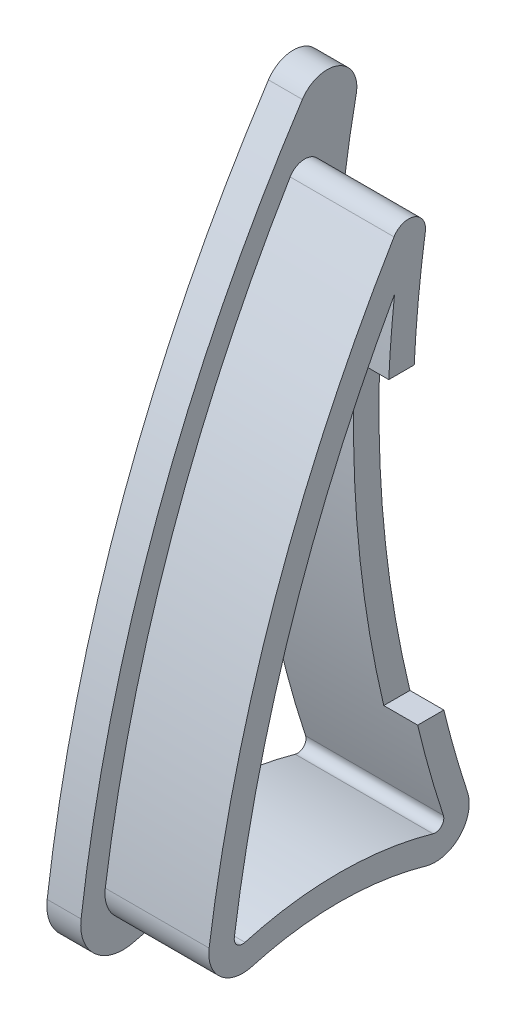
ISO-10303-21;
HEADER;
FILE_DESCRIPTION(('STEP AP214'),'2;1');
FILE_NAME('part.step','',(''),(''),'','','');
FILE_SCHEMA(('AUTOMOTIVE_DESIGN { 1 0 10303 214 1 1 1 1 }'));
ENDSEC;
DATA;
#1=APPLICATION_CONTEXT('core data for automotive mechanical design processes');
#2=APPLICATION_PROTOCOL_DEFINITION('international standard','automotive_design',2000,#1);
#3=PRODUCT_CONTEXT('',#1,'mechanical');
#4=PRODUCT('Part','Part','',(#3));
#5=PRODUCT_RELATED_PRODUCT_CATEGORY('part','',(#4));
#6=PRODUCT_DEFINITION_FORMATION('','',#4);
#7=PRODUCT_DEFINITION_CONTEXT('part definition',#1,'design');
#8=PRODUCT_DEFINITION('design','',#6,#7);
#9=PRODUCT_DEFINITION_SHAPE('','',#8);
#10=(LENGTH_UNIT() NAMED_UNIT(*) SI_UNIT(.MILLI.,.METRE.));
#11=(NAMED_UNIT(*) PLANE_ANGLE_UNIT() SI_UNIT($,.RADIAN.));
#12=(NAMED_UNIT(*) SI_UNIT($,.STERADIAN.) SOLID_ANGLE_UNIT());
#13=UNCERTAINTY_MEASURE_WITH_UNIT(LENGTH_MEASURE(1.E-05),#10,'distance_accuracy_value','');
#14=(GEOMETRIC_REPRESENTATION_CONTEXT(3) GLOBAL_UNCERTAINTY_ASSIGNED_CONTEXT((#13)) GLOBAL_UNIT_ASSIGNED_CONTEXT((#10,
#11,#12)) REPRESENTATION_CONTEXT('',''));
#15=CARTESIAN_POINT('',(0.,0.,0.));
#16=DIRECTION('',(0.,0.,1.));
#17=DIRECTION('',(1.,0.,0.));
#18=AXIS2_PLACEMENT_3D('',#15,#16,#17);
#19=CARTESIAN_POINT('',(0.,-85.725,-146.831685531547));
#20=DIRECTION('',(-1.,0.,0.));
#21=DIRECTION('',(0.,0.,-1.));
#22=AXIS2_PLACEMENT_3D('',#19,#20,#21);
#23=CYLINDRICAL_SURFACE('',#22,210.331685531547);
#24=CARTESIAN_POINT('',(-15.5575,-85.725,-146.831685531547));
#25=DIRECTION('',(1.,0.,0.));
#26=DIRECTION('',(0.,0.,-1.));
#27=AXIS2_PLACEMENT_3D('',#24,#25,#26);
#28=CIRCLE('',#27,210.331685531547);
#29=CARTESIAN_POINT('',(-15.5575,22.1489173700403,33.730314595233));
#30=VERTEX_POINT('',#29);
#31=CARTESIAN_POINT('',(-15.5575,-56.286781255573,61.4297108329661));
#32=VERTEX_POINT('',#31);
#33=EDGE_CURVE('E246',#30,#32,#28,.T.);
#34=ORIENTED_EDGE('',*,*,#33,.T.);
#35=DIRECTION('',(-1.,0.,0.));
#36=VECTOR('',#35,1.);
#37=CARTESIAN_POINT('',(0.,-56.286781255573,61.4297108329661));
#38=LINE('',#37,#36);
#39=CARTESIAN_POINT('',(0.,-56.286781255573,61.4297108329661));
#40=VERTEX_POINT('',#39);
#41=EDGE_CURVE('E245',#40,#32,#38,.T.);
#42=ORIENTED_EDGE('',*,*,#41,.F.);
#43=CARTESIAN_POINT('',(0.,-85.725,-146.831685531547));
#44=DIRECTION('',(1.,0.,0.));
#45=DIRECTION('',(0.,0.,-1.));
#46=AXIS2_PLACEMENT_3D('',#43,#44,#45);
#47=CIRCLE('',#46,210.331685531547);
#48=CARTESIAN_POINT('',(0.,22.1489173700403,33.730314595233));
#49=VERTEX_POINT('',#48);
#50=EDGE_CURVE('E223',#49,#40,#47,.T.);
#51=ORIENTED_EDGE('',*,*,#50,.F.);
#52=DIRECTION('',(-1.,0.,0.));
#53=VECTOR('',#52,1.);
#54=CARTESIAN_POINT('',(0.,22.1489173700403,33.730314595233));
#55=LINE('',#54,#53);
#56=EDGE_CURVE('E264',#49,#30,#55,.T.);
#57=ORIENTED_EDGE('',*,*,#56,.T.);
#58=EDGE_LOOP('',(#34,#42,#51,#57));
#59=FACE_BOUND('',#58,.T.);
#60=ADVANCED_FACE('F44',(#59),#23,.T.);
#61=CARTESIAN_POINT('',(0.,20.8462142160792,31.5498182084761));
#62=DIRECTION('',(-1.,0.,0.));
#63=DIRECTION('',(0.,0.,-1.));
#64=AXIS2_PLACEMENT_3D('',#61,#62,#63);
#65=CYLINDRICAL_SURFACE('',#64,2.53999999999998);
#66=CARTESIAN_POINT('',(-15.5575,20.8462142160792,31.5498182084761));
#67=DIRECTION('',(1.,0.,0.));
#68=DIRECTION('',(0.,0.,-1.));
#69=AXIS2_PLACEMENT_3D('',#66,#67,#68);
#70=CIRCLE('',#69,2.53999999999998);
#71=CARTESIAN_POINT('',(-15.5575,20.4641245910413,29.0387213329179));
#72=VERTEX_POINT('',#71);
#73=EDGE_CURVE('E228',#72,#30,#70,.T.);
#74=ORIENTED_EDGE('',*,*,#73,.T.);
#75=ORIENTED_EDGE('',*,*,#56,.F.);
#76=CARTESIAN_POINT('',(0.,20.8462142160792,31.5498182084761));
#77=DIRECTION('',(1.,0.,0.));
#78=DIRECTION('',(0.,0.,-1.));
#79=AXIS2_PLACEMENT_3D('',#76,#77,#78);
#80=CIRCLE('',#79,2.53999999999998);
#81=CARTESIAN_POINT('',(0.,20.4641245910413,29.0387213329179));
#82=VERTEX_POINT('',#81);
#83=EDGE_CURVE('E242',#82,#49,#80,.T.);
#84=ORIENTED_EDGE('',*,*,#83,.F.);
#85=DIRECTION('',(-1.,0.,0.));
#86=VECTOR('',#85,1.);
#87=CARTESIAN_POINT('',(0.,20.4641245910413,29.0387213329179));
#88=LINE('',#87,#86);
#89=EDGE_CURVE('E268',#82,#72,#88,.T.);
#90=ORIENTED_EDGE('',*,*,#89,.T.);
#91=EDGE_LOOP('',(#74,#75,#84,#90));
#92=FACE_BOUND('',#91,.T.);
#93=ADVANCED_FACE('F458',(#92),#65,.T.);
#94=CARTESIAN_POINT('',(0.,-4.22030411994143,-133.187593513881));
#95=DIRECTION('',(-1.,0.,0.));
#96=DIRECTION('',(0.,0.,-1.));
#97=AXIS2_PLACEMENT_3D('',#94,#95,#96);
#98=CYLINDRICAL_SURFACE('',#97,164.093565533692);
#99=DIRECTION('',(-1.,0.,0.));
#100=VECTOR('',#99,1.);
#101=CARTESIAN_POINT('',(0.,-42.9737697069895,26.2641771083162));
#102=LINE('',#101,#100);
#103=CARTESIAN_POINT('',(-5.08,-42.9737697069895,26.2641771083162));
#104=VERTEX_POINT('',#103);
#105=CARTESIAN_POINT('',(0.,-42.9737697069895,26.2641771083162));
#106=VERTEX_POINT('',#105);
#107=EDGE_CURVE('E326',#104,#106,#102,.F.);
#108=ORIENTED_EDGE('',*,*,#107,.T.);
#109=CARTESIAN_POINT('',(0.,-4.22030411994143,-133.187593513881));
#110=DIRECTION('',(-1.,0.,0.));
#111=DIRECTION('',(0.,0.,-1.));
#112=AXIS2_PLACEMENT_3D('',#109,#110,#111);
#113=CIRCLE('',#112,164.093565533692);
#114=CARTESIAN_POINT('',(0.,-55.4129631360347,22.7162547786557));
#115=VERTEX_POINT('',#114);
#116=EDGE_CURVE('E238',#115,#106,#113,.T.);
#117=ORIENTED_EDGE('',*,*,#116,.F.);
#118=DIRECTION('',(-1.,0.,0.));
#119=VECTOR('',#118,1.);
#120=CARTESIAN_POINT('',(0.,-55.4129631360347,22.7162547786557));
#121=LINE('',#120,#119);
#122=CARTESIAN_POINT('',(-15.5575,-55.4129631360347,22.7162547786557));
#123=VERTEX_POINT('',#122);
#124=EDGE_CURVE('E272',#115,#123,#121,.T.);
#125=ORIENTED_EDGE('',*,*,#124,.T.);
#126=CARTESIAN_POINT('',(-15.5575,-4.22030411994143,-133.187593513881));
#127=DIRECTION('',(-1.,0.,0.));
#128=DIRECTION('',(0.,0.,-1.));
#129=AXIS2_PLACEMENT_3D('',#126,#127,#128);
#130=CIRCLE('',#129,164.093565533692);
#131=EDGE_CURVE('E259',#123,#72,#130,.T.);
#132=ORIENTED_EDGE('',*,*,#131,.T.);
#133=ORIENTED_EDGE('',*,*,#89,.F.);
#134=CARTESIAN_POINT('',(0.,4.01623029301051,30.6991287988939));
#135=VERTEX_POINT('',#134);
#136=EDGE_CURVE('E237',#135,#82,#113,.T.);
#137=ORIENTED_EDGE('',*,*,#136,.F.);
#138=DIRECTION('',(-1.,0.,0.));
#139=VECTOR('',#138,1.);
#140=CARTESIAN_POINT('',(0.,4.01623029301051,30.6991287988938));
#141=LINE('',#140,#139);
#142=CARTESIAN_POINT('',(-5.08,4.01623029301051,30.6991287988939));
#143=VERTEX_POINT('',#142);
#144=EDGE_CURVE('E319',#135,#143,#141,.T.);
#145=ORIENTED_EDGE('',*,*,#144,.T.);
#146=CARTESIAN_POINT('',(-5.08,-4.22030411994143,-133.187593513881));
#147=DIRECTION('',(1.,0.,0.));
#148=DIRECTION('',(0.,0.,-1.));
#149=AXIS2_PLACEMENT_3D('',#146,#147,#148);
#150=CIRCLE('',#149,164.093565533692);
#151=EDGE_CURVE('E308',#143,#104,#150,.T.);
#152=ORIENTED_EDGE('',*,*,#151,.T.);
#153=EDGE_LOOP('',(#108,#117,#125,#132,#133,#137,#145,#152));
#154=FACE_BOUND('',#153,.T.);
#155=ADVANCED_FACE('F463',(#154),#98,.F.);
#156=CARTESIAN_POINT('',(0.,-56.9977827903335,27.5427179416094));
#157=DIRECTION('',(-1.,0.,0.));
#158=DIRECTION('',(0.,0.,-1.));
#159=AXIS2_PLACEMENT_3D('',#156,#157,#158);
#160=CYLINDRICAL_SURFACE('',#159,5.08000000000003);
#161=CARTESIAN_POINT('',(-15.5575,-56.9977827903335,27.5427179416094));
#162=DIRECTION('',(1.,0.,0.));
#163=DIRECTION('',(0.,0.,-1.));
#164=AXIS2_PLACEMENT_3D('',#161,#162,#163);
#165=CIRCLE('',#164,5.08000000000003);
#166=CARTESIAN_POINT('',(-15.5575,-61.8834345749108,28.9344099477143));
#167=VERTEX_POINT('',#166);
#168=EDGE_CURVE('E256',#167,#123,#165,.T.);
#169=ORIENTED_EDGE('',*,*,#168,.T.);
#170=ORIENTED_EDGE('',*,*,#124,.F.);
#171=CARTESIAN_POINT('',(0.,-56.9977827903335,27.5427179416094));
#172=DIRECTION('',(1.,0.,0.));
#173=DIRECTION('',(0.,0.,-1.));
#174=AXIS2_PLACEMENT_3D('',#171,#172,#173);
#175=CIRCLE('',#174,5.08000000000003);
#176=CARTESIAN_POINT('',(0.,-61.8834345749108,28.9344099477143));
#177=VERTEX_POINT('',#176);
#178=EDGE_CURVE('E234',#177,#115,#175,.T.);
#179=ORIENTED_EDGE('',*,*,#178,.F.);
#180=DIRECTION('',(-1.,0.,0.));
#181=VECTOR('',#180,1.);
#182=CARTESIAN_POINT('',(0.,-61.8834345749108,28.9344099477143));
#183=LINE('',#182,#181);
#184=EDGE_CURVE('E276',#177,#167,#183,.T.);
#185=ORIENTED_EDGE('',*,*,#184,.T.);
#186=EDGE_LOOP('',(#169,#170,#179,#185));
#187=FACE_BOUND('',#186,.T.);
#188=ADVANCED_FACE('F489',(#187),#160,.T.);
#189=CARTESIAN_POINT('',(0.,-107.650236586618,41.9712155394964));
#190=DIRECTION('',(-1.,0.,0.));
#191=DIRECTION('',(0.,0.,-1.));
#192=AXIS2_PLACEMENT_3D('',#189,#190,#191);
#193=CYLINDRICAL_SURFACE('',#192,47.5873771752204);
#194=CARTESIAN_POINT('',(-15.5575,-107.650236586618,41.9712155394964));
#195=DIRECTION('',(-1.,0.,0.));
#196=DIRECTION('',(0.,0.,-1.));
#197=AXIS2_PLACEMENT_3D('',#194,#195,#196);
#198=CIRCLE('',#197,47.5873771752204);
#199=CARTESIAN_POINT('',(-15.5575,-61.8834345749108,55.0080211312785));
#200=VERTEX_POINT('',#199);
#201=EDGE_CURVE('E253',#200,#167,#198,.T.);
#202=ORIENTED_EDGE('',*,*,#201,.T.);
#203=ORIENTED_EDGE('',*,*,#184,.F.);
#204=CARTESIAN_POINT('',(0.,-107.650236586618,41.9712155394964));
#205=DIRECTION('',(-1.,0.,0.));
#206=DIRECTION('',(0.,0.,-1.));
#207=AXIS2_PLACEMENT_3D('',#204,#205,#206);
#208=CIRCLE('',#207,47.5873771752204);
#209=CARTESIAN_POINT('',(0.,-61.8834345749108,55.0080211312785));
#210=VERTEX_POINT('',#209);
#211=EDGE_CURVE('E231',#210,#177,#208,.T.);
#212=ORIENTED_EDGE('',*,*,#211,.F.);
#213=DIRECTION('',(-1.,0.,0.));
#214=VECTOR('',#213,1.);
#215=CARTESIAN_POINT('',(0.,-61.8834345749108,55.0080211312785));
#216=LINE('',#215,#214);
#217=EDGE_CURVE('E280',#210,#200,#216,.T.);
#218=ORIENTED_EDGE('',*,*,#217,.T.);
#219=EDGE_LOOP('',(#202,#203,#212,#218));
#220=FACE_BOUND('',#219,.T.);
#221=ADVANCED_FACE('F493',(#220),#193,.F.);
#222=CARTESIAN_POINT('',(0.,-56.9977827903335,56.3997131373834));
#223=DIRECTION('',(-1.,0.,0.));
#224=DIRECTION('',(0.,0.,-1.));
#225=AXIS2_PLACEMENT_3D('',#222,#223,#224);
#226=CYLINDRICAL_SURFACE('',#225,5.07999999999998);
#227=CARTESIAN_POINT('',(-15.5575,-56.9977827903335,56.3997131373834));
#228=DIRECTION('',(1.,0.,0.));
#229=DIRECTION('',(0.,0.,-1.));
#230=AXIS2_PLACEMENT_3D('',#227,#228,#229);
#231=CIRCLE('',#230,5.07999999999998);
#232=EDGE_CURVE('E250',#32,#200,#231,.T.);
#233=ORIENTED_EDGE('',*,*,#232,.T.);
#234=ORIENTED_EDGE('',*,*,#217,.F.);
#235=CARTESIAN_POINT('',(0.,-56.9977827903335,56.3997131373834));
#236=DIRECTION('',(1.,0.,0.));
#237=DIRECTION('',(0.,0.,-1.));
#238=AXIS2_PLACEMENT_3D('',#235,#236,#237);
#239=CIRCLE('',#238,5.07999999999998);
#240=EDGE_CURVE('E227',#40,#210,#239,.T.);
#241=ORIENTED_EDGE('',*,*,#240,.F.);
#242=ORIENTED_EDGE('',*,*,#41,.T.);
#243=EDGE_LOOP('',(#233,#234,#241,#242));
#244=FACE_BOUND('',#243,.T.);
#245=ADVANCED_FACE('F477',(#244),#226,.T.);
#246=CARTESIAN_POINT('',(0.,-71.3613913951668,-45.2159861970819));
#247=DIRECTION('',(-1.,0.,0.));
#248=DIRECTION('',(0.,0.,-1.));
#249=AXIS2_PLACEMENT_3D('',#246,#247,#248);
#250=PLANE('',#249);
#251=CARTESIAN_POINT('',(0.,-4.22030411994143,-133.187593513881));
#252=DIRECTION('',(-1.,0.,0.));
#253=DIRECTION('',(0.,0.,-1.));
#254=AXIS2_PLACEMENT_3D('',#251,#252,#253);
#255=CIRCLE('',#254,167.903565533692);
#256=CARTESIAN_POINT('',(0.,-56.6015778767588,26.336102150871));
#257=VERTEX_POINT('',#256);
#258=CARTESIAN_POINT('',(0.,-42.9737697069894,30.1824656276904));
#259=VERTEX_POINT('',#258);
#260=EDGE_CURVE('E222',#257,#259,#255,.T.);
#261=ORIENTED_EDGE('',*,*,#260,.F.);
#262=CARTESIAN_POINT('',(0.,-56.9977827903335,27.5427179416094));
#263=DIRECTION('',(1.,0.,0.));
#264=DIRECTION('',(0.,0.,-1.));
#265=AXIS2_PLACEMENT_3D('',#262,#263,#264);
#266=CIRCLE('',#265,1.27000000000003);
#267=CARTESIAN_POINT('',(0.,-58.2191957364778,27.8906409431356));
#268=VERTEX_POINT('',#267);
#269=EDGE_CURVE('E339',#268,#257,#266,.T.);
#270=ORIENTED_EDGE('',*,*,#269,.F.);
#271=CARTESIAN_POINT('',(0.,-107.650236586618,41.9712155394964));
#272=DIRECTION('',(-1.,0.,0.));
#273=DIRECTION('',(0.,0.,-1.));
#274=AXIS2_PLACEMENT_3D('',#271,#272,#273);
#275=CIRCLE('',#274,51.3973771752205);
#276=CARTESIAN_POINT('',(0.,-58.2191957364778,56.0517901358572));
#277=VERTEX_POINT('',#276);
#278=EDGE_CURVE('E207',#277,#268,#275,.T.);
#279=ORIENTED_EDGE('',*,*,#278,.F.);
#280=CARTESIAN_POINT('',(0.,-56.9977827903335,56.3997131373834));
#281=DIRECTION('',(1.,0.,0.));
#282=DIRECTION('',(0.,0.,-1.));
#283=AXIS2_PLACEMENT_3D('',#280,#281,#282);
#284=CIRCLE('',#283,1.26999999999998);
#285=CARTESIAN_POINT('',(0.,-56.8200324066434,57.6572125612791));
#286=VERTEX_POINT('',#285);
#287=EDGE_CURVE('E334',#286,#277,#284,.T.);
#288=ORIENTED_EDGE('',*,*,#287,.F.);
#289=CARTESIAN_POINT('',(0.,-85.725,-146.831685531547));
#290=DIRECTION('',(1.,0.,0.));
#291=DIRECTION('',(0.,0.,-1.));
#292=AXIS2_PLACEMENT_3D('',#289,#290,#291);
#293=CIRCLE('',#292,206.521685531547);
#294=CARTESIAN_POINT('',(0.,14.6601962640268,33.6510531606171));
#295=VERTEX_POINT('',#294);
#296=EDGE_CURVE('E330',#295,#286,#293,.T.);
#297=ORIENTED_EDGE('',*,*,#296,.F.);
#298=CARTESIAN_POINT('',(0.,4.01623029301051,34.513828125267));
#299=VERTEX_POINT('',#298);
#300=EDGE_CURVE('E342',#299,#295,#255,.T.);
#301=ORIENTED_EDGE('',*,*,#300,.F.);
#302=DIRECTION('',(0.,0.,1.));
#303=VECTOR('',#302,1.);
#304=CARTESIAN_POINT('',(0.,4.01623029301051,-45.2159861970819));
#305=LINE('',#304,#303);
#306=EDGE_CURVE('E295',#135,#299,#305,.T.);
#307=ORIENTED_EDGE('',*,*,#306,.F.);
#308=ORIENTED_EDGE('',*,*,#136,.T.);
#309=ORIENTED_EDGE('',*,*,#83,.T.);
#310=ORIENTED_EDGE('',*,*,#50,.T.);
#311=ORIENTED_EDGE('',*,*,#240,.T.);
#312=ORIENTED_EDGE('',*,*,#211,.T.);
#313=ORIENTED_EDGE('',*,*,#178,.T.);
#314=ORIENTED_EDGE('',*,*,#116,.T.);
#315=DIRECTION('',(0.,0.,-1.));
#316=VECTOR('',#315,1.);
#317=CARTESIAN_POINT('',(0.,-42.9737697069895,-45.2159861970819));
#318=LINE('',#317,#316);
#319=EDGE_CURVE('E323',#259,#106,#318,.T.);
#320=ORIENTED_EDGE('',*,*,#319,.F.);
#321=EDGE_LOOP('',(#261,#270,#279,#288,#297,#301,#307,#308,#309,#310,#311,#312,#313,#314,#320));
#322=FACE_BOUND('',#321,.T.);
#323=ADVANCED_FACE('F481',(#322),#250,.F.);
#324=CARTESIAN_POINT('',(0.,-85.725,-146.831685531547));
#325=DIRECTION('',(-1.,0.,0.));
#326=DIRECTION('',(0.,0.,-1.));
#327=AXIS2_PLACEMENT_3D('',#324,#325,#326);
#328=CYLINDRICAL_SURFACE('',#327,206.521685531547);
#329=DIRECTION('',(-1.,0.,0.));
#330=VECTOR('',#329,1.);
#331=CARTESIAN_POINT('',(0.,14.6601962640268,33.6510531606171));
#332=LINE('',#331,#330);
#333=CARTESIAN_POINT('',(-20.6375,14.6601962640268,33.6510531606171));
#334=VERTEX_POINT('',#333);
#335=EDGE_CURVE('E213',#295,#334,#332,.T.);
#336=ORIENTED_EDGE('',*,*,#335,.F.);
#337=ORIENTED_EDGE('',*,*,#296,.T.);
#338=DIRECTION('',(-1.,0.,0.));
#339=VECTOR('',#338,1.);
#340=CARTESIAN_POINT('',(0.,-56.8200324066434,57.6572125612791));
#341=LINE('',#340,#339);
#342=CARTESIAN_POINT('',(-20.6375,-56.8200324066434,57.6572125612791));
#343=VERTEX_POINT('',#342);
#344=EDGE_CURVE('E215',#286,#343,#341,.T.);
#345=ORIENTED_EDGE('',*,*,#344,.T.);
#346=CARTESIAN_POINT('',(-20.6375,-85.725,-146.831685531547));
#347=DIRECTION('',(1.,0.,0.));
#348=DIRECTION('',(0.,0.,-1.));
#349=AXIS2_PLACEMENT_3D('',#346,#347,#348);
#350=CIRCLE('',#349,206.521685531547);
#351=EDGE_CURVE('E351',#334,#343,#350,.T.);
#352=ORIENTED_EDGE('',*,*,#351,.F.);
#353=EDGE_LOOP('',(#336,#337,#345,#352));
#354=FACE_BOUND('',#353,.T.);
#355=ADVANCED_FACE('F349',(#354),#328,.F.);
#356=CARTESIAN_POINT('',(0.,-4.22030411994143,-133.187593513881));
#357=DIRECTION('',(-1.,0.,0.));
#358=DIRECTION('',(0.,0.,-1.));
#359=AXIS2_PLACEMENT_3D('',#356,#357,#358);
#360=CYLINDRICAL_SURFACE('',#359,167.903565533692);
#361=CARTESIAN_POINT('',(-5.08,-4.22030411994143,-133.187593513881));
#362=DIRECTION('',(1.,0.,0.));
#363=DIRECTION('',(0.,0.,-1.));
#364=AXIS2_PLACEMENT_3D('',#361,#362,#363);
#365=CIRCLE('',#364,167.903565533692);
#366=CARTESIAN_POINT('',(-5.08,4.01623029301051,34.513828125267));
#367=VERTEX_POINT('',#366);
#368=CARTESIAN_POINT('',(-5.08,-42.9737697069894,30.1824656276904));
#369=VERTEX_POINT('',#368);
#370=EDGE_CURVE('E300',#367,#369,#365,.T.);
#371=ORIENTED_EDGE('',*,*,#370,.F.);
#372=DIRECTION('',(-1.,0.,0.));
#373=VECTOR('',#372,1.);
#374=CARTESIAN_POINT('',(0.,4.01623029301051,34.513828125267));
#375=LINE('',#374,#373);
#376=EDGE_CURVE('E52',#299,#367,#375,.T.);
#377=ORIENTED_EDGE('',*,*,#376,.F.);
#378=ORIENTED_EDGE('',*,*,#300,.T.);
#379=ORIENTED_EDGE('',*,*,#335,.T.);
#380=CARTESIAN_POINT('',(-20.6375,-4.22030411994143,-133.187593513881));
#381=DIRECTION('',(-1.,0.,0.));
#382=DIRECTION('',(0.,0.,-1.));
#383=AXIS2_PLACEMENT_3D('',#380,#381,#382);
#384=CIRCLE('',#383,167.903565533692);
#385=CARTESIAN_POINT('',(-20.6375,-56.6015778767588,26.336102150871));
#386=VERTEX_POINT('',#385);
#387=EDGE_CURVE('E203',#386,#334,#384,.T.);
#388=ORIENTED_EDGE('',*,*,#387,.F.);
#389=DIRECTION('',(-1.,0.,0.));
#390=VECTOR('',#389,1.);
#391=CARTESIAN_POINT('',(0.,-56.6015778767588,26.336102150871));
#392=LINE('',#391,#390);
#393=EDGE_CURVE('E200',#257,#386,#392,.T.);
#394=ORIENTED_EDGE('',*,*,#393,.F.);
#395=ORIENTED_EDGE('',*,*,#260,.T.);
#396=DIRECTION('',(-1.,0.,0.));
#397=VECTOR('',#396,1.);
#398=CARTESIAN_POINT('',(0.,-42.9737697069895,30.1824656276904));
#399=LINE('',#398,#397);
#400=EDGE_CURVE('E11',#369,#259,#399,.F.);
#401=ORIENTED_EDGE('',*,*,#400,.F.);
#402=EDGE_LOOP('',(#371,#377,#378,#379,#388,#394,#395,#401));
#403=FACE_BOUND('',#402,.T.);
#404=ADVANCED_FACE('F301',(#403),#360,.T.);
#405=CARTESIAN_POINT('',(0.,-56.9977827903335,27.5427179416094));
#406=DIRECTION('',(-1.,0.,0.));
#407=DIRECTION('',(0.,0.,-1.));
#408=AXIS2_PLACEMENT_3D('',#405,#406,#407);
#409=CYLINDRICAL_SURFACE('',#408,1.27000000000003);
#410=DIRECTION('',(-1.,0.,0.));
#411=VECTOR('',#410,1.);
#412=CARTESIAN_POINT('',(0.,-58.2191957364778,27.8906409431356));
#413=LINE('',#412,#411);
#414=CARTESIAN_POINT('',(-20.6375,-58.2191957364778,27.8906409431356));
#415=VERTEX_POINT('',#414);
#416=EDGE_CURVE('E199',#268,#415,#413,.T.);
#417=ORIENTED_EDGE('',*,*,#416,.F.);
#418=ORIENTED_EDGE('',*,*,#269,.T.);
#419=ORIENTED_EDGE('',*,*,#393,.T.);
#420=CARTESIAN_POINT('',(-20.6375,-56.9977827903335,27.5427179416094));
#421=DIRECTION('',(1.,0.,0.));
#422=DIRECTION('',(0.,0.,-1.));
#423=AXIS2_PLACEMENT_3D('',#420,#421,#422);
#424=CIRCLE('',#423,1.27000000000002);
#425=EDGE_CURVE('E189',#415,#386,#424,.T.);
#426=ORIENTED_EDGE('',*,*,#425,.F.);
#427=EDGE_LOOP('',(#417,#418,#419,#426));
#428=FACE_BOUND('',#427,.T.);
#429=ADVANCED_FACE('F197',(#428),#409,.F.);
#430=CARTESIAN_POINT('',(0.,-107.650236586618,41.9712155394964));
#431=DIRECTION('',(-1.,0.,0.));
#432=DIRECTION('',(0.,0.,-1.));
#433=AXIS2_PLACEMENT_3D('',#430,#431,#432);
#434=CYLINDRICAL_SURFACE('',#433,51.3973771752205);
#435=DIRECTION('',(-1.,0.,0.));
#436=VECTOR('',#435,1.);
#437=CARTESIAN_POINT('',(0.,-58.2191957364778,56.0517901358572));
#438=LINE('',#437,#436);
#439=CARTESIAN_POINT('',(-20.6375,-58.2191957364778,56.0517901358572));
#440=VERTEX_POINT('',#439);
#441=EDGE_CURVE('E66',#277,#440,#438,.T.);
#442=ORIENTED_EDGE('',*,*,#441,.F.);
#443=ORIENTED_EDGE('',*,*,#278,.T.);
#444=ORIENTED_EDGE('',*,*,#416,.T.);
#445=CARTESIAN_POINT('',(-20.6375,-107.650236586618,41.9712155394964));
#446=DIRECTION('',(-1.,0.,0.));
#447=DIRECTION('',(0.,0.,-1.));
#448=AXIS2_PLACEMENT_3D('',#445,#446,#447);
#449=CIRCLE('',#448,51.3973771752205);
#450=EDGE_CURVE('E186',#440,#415,#449,.T.);
#451=ORIENTED_EDGE('',*,*,#450,.F.);
#452=EDGE_LOOP('',(#442,#443,#444,#451));
#453=FACE_BOUND('',#452,.T.);
#454=ADVANCED_FACE('F205',(#453),#434,.T.);
#455=CARTESIAN_POINT('',(0.,-56.9977827903335,56.3997131373834));
#456=DIRECTION('',(-1.,0.,0.));
#457=DIRECTION('',(0.,0.,-1.));
#458=AXIS2_PLACEMENT_3D('',#455,#456,#457);
#459=CYLINDRICAL_SURFACE('',#458,1.26999999999998);
#460=ORIENTED_EDGE('',*,*,#344,.F.);
#461=ORIENTED_EDGE('',*,*,#287,.T.);
#462=ORIENTED_EDGE('',*,*,#441,.T.);
#463=CARTESIAN_POINT('',(-20.6375,-56.9977827903335,56.3997131373834));
#464=DIRECTION('',(1.,0.,0.));
#465=DIRECTION('',(0.,0.,-1.));
#466=AXIS2_PLACEMENT_3D('',#463,#464,#465);
#467=CIRCLE('',#466,1.26999999999998);
#468=EDGE_CURVE('E192',#343,#440,#467,.T.);
#469=ORIENTED_EDGE('',*,*,#468,.F.);
#470=EDGE_LOOP('',(#460,#461,#462,#469));
#471=FACE_BOUND('',#470,.T.);
#472=ADVANCED_FACE('F497',(#471),#459,.F.);
#473=CARTESIAN_POINT('',(5.08,-42.9737697069895,13.1619216544243));
#474=DIRECTION('',(0.,-1.,0.));
#475=DIRECTION('',(0.,0.,-1.));
#476=AXIS2_PLACEMENT_3D('',#473,#474,#475);
#477=PLANE('',#476);
#478=ORIENTED_EDGE('',*,*,#107,.F.);
#479=DIRECTION('',(0.,0.,-1.));
#480=VECTOR('',#479,1.);
#481=CARTESIAN_POINT('',(-5.08,-42.9737697069895,13.1619216544243));
#482=LINE('',#481,#480);
#483=EDGE_CURVE('E58',#369,#104,#482,.T.);
#484=ORIENTED_EDGE('',*,*,#483,.F.);
#485=ORIENTED_EDGE('',*,*,#400,.T.);
#486=ORIENTED_EDGE('',*,*,#319,.T.);
#487=EDGE_LOOP('',(#478,#484,#485,#486));
#488=FACE_BOUND('',#487,.T.);
#489=ADVANCED_FACE('F495',(#488),#477,.F.);
#490=CARTESIAN_POINT('',(5.08,4.01623029301051,17.9817525383818));
#491=DIRECTION('',(0.,1.,0.));
#492=DIRECTION('',(0.,0.,1.));
#493=AXIS2_PLACEMENT_3D('',#490,#491,#492);
#494=PLANE('',#493);
#495=ORIENTED_EDGE('',*,*,#144,.F.);
#496=ORIENTED_EDGE('',*,*,#306,.T.);
#497=ORIENTED_EDGE('',*,*,#376,.T.);
#498=DIRECTION('',(0.,0.,1.));
#499=VECTOR('',#498,1.);
#500=CARTESIAN_POINT('',(-5.08,4.01623029301051,17.9817525383818));
#501=LINE('',#500,#499);
#502=EDGE_CURVE('E293',#143,#367,#501,.T.);
#503=ORIENTED_EDGE('',*,*,#502,.F.);
#504=EDGE_LOOP('',(#495,#496,#497,#503));
#505=FACE_BOUND('',#504,.T.);
#506=ADVANCED_FACE('F292',(#505),#494,.F.);
#507=CARTESIAN_POINT('',(-5.08,-4.22030411994143,-133.187593513881));
#508=DIRECTION('',(-1.,0.,0.));
#509=DIRECTION('',(0.,0.,-1.));
#510=AXIS2_PLACEMENT_3D('',#507,#508,#509);
#511=PLANE('',#510);
#512=ORIENTED_EDGE('',*,*,#151,.F.);
#513=ORIENTED_EDGE('',*,*,#502,.T.);
#514=ORIENTED_EDGE('',*,*,#370,.T.);
#515=ORIENTED_EDGE('',*,*,#483,.T.);
#516=EDGE_LOOP('',(#512,#513,#514,#515));
#517=FACE_BOUND('',#516,.T.);
#518=ADVANCED_FACE('F503',(#517),#511,.F.);
#519=CARTESIAN_POINT('',(-20.6375,-31.7501598146655,-54.5504945335296));
#520=DIRECTION('',(-1.,0.,0.));
#521=DIRECTION('',(0.,0.,-1.));
#522=AXIS2_PLACEMENT_3D('',#519,#520,#521);
#523=PLANE('',#522);
#524=CARTESIAN_POINT('',(-20.6375,-59.2800155093896,24.0866044468213));
#525=DIRECTION('',(1.,0.,0.));
#526=DIRECTION('',(0.,0.,-1.));
#527=AXIS2_PLACEMENT_3D('',#524,#525,#526);
#528=CIRCLE('',#527,6.35000000000001);
#529=CARTESIAN_POINT('',(-20.6375,-65.4051524477252,25.76147682603));
#530=VERTEX_POINT('',#529);
#531=CARTESIAN_POINT('',(-20.6375,-57.1818237903129,18.093267186997));
#532=VERTEX_POINT('',#531);
#533=EDGE_CURVE('E360',#530,#532,#528,.T.);
#534=ORIENTED_EDGE('',*,*,#533,.F.);
#535=CARTESIAN_POINT('',(-20.6375,-122.678306404963,41.4223876920017));
#536=DIRECTION('',(-1.,0.,0.));
#537=DIRECTION('',(0.,0.,1.));
#538=AXIS2_PLACEMENT_3D('',#535,#536,#537);
#539=CIRCLE('',#538,59.375738255296);
#540=CARTESIAN_POINT('',(-20.6375,-65.4051524477253,57.0832985579734));
#541=VERTEX_POINT('',#540);
#542=EDGE_CURVE('E381',#541,#530,#539,.T.);
#543=ORIENTED_EDGE('',*,*,#542,.F.);
#544=CARTESIAN_POINT('',(-20.6375,-59.2800155093896,58.7581709371821));
#545=DIRECTION('',(1.,0.,0.));
#546=DIRECTION('',(0.,0.,-1.));
#547=AXIS2_PLACEMENT_3D('',#544,#545,#546);
#548=CIRCLE('',#547,6.34999999999998);
#549=CARTESIAN_POINT('',(-20.6375,-58.4698907227488,65.0562815927732));
#550=VERTEX_POINT('',#549);
#551=EDGE_CURVE('E377',#550,#541,#548,.T.);
#552=ORIENTED_EDGE('',*,*,#551,.F.);
#553=CARTESIAN_POINT('',(-20.6375,-85.725,-146.831685531547));
#554=DIRECTION('',(1.,0.,0.));
#555=DIRECTION('',(0.,0.,-1.));
#556=AXIS2_PLACEMENT_3D('',#553,#554,#555);
#557=CIRCLE('',#556,213.633685531547);
#558=CARTESIAN_POINT('',(-20.6375,31.2899695701312,31.9051279409249));
#559=VERTEX_POINT('',#558);
#560=EDGE_CURVE('E373',#559,#550,#557,.T.);
#561=ORIENTED_EDGE('',*,*,#560,.F.);
#562=CARTESIAN_POINT('',(-20.6375,28.8552807782158,28.1862147278313));
#563=DIRECTION('',(1.,0.,0.));
#564=DIRECTION('',(0.,0.,-1.));
#565=AXIS2_PLACEMENT_3D('',#562,#563,#564);
#566=CIRCLE('',#565,4.445);
#567=CARTESIAN_POINT('',(-20.6375,27.9627763458729,23.8317387733394));
#568=VERTEX_POINT('',#567);
#569=EDGE_CURVE('E369',#568,#559,#566,.T.);
#570=ORIENTED_EDGE('',*,*,#569,.F.);
#571=CARTESIAN_POINT('',(-20.6375,-4.22030411994143,-133.187593513881));
#572=DIRECTION('',(-1.,0.,0.));
#573=DIRECTION('',(0.,0.,-1.));
#574=AXIS2_PLACEMENT_3D('',#571,#572,#573);
#575=CIRCLE('',#574,160.283565533692);
#576=EDGE_CURVE('E364',#532,#568,#575,.T.);
#577=ORIENTED_EDGE('',*,*,#576,.F.);
#578=EDGE_LOOP('',(#534,#543,#552,#561,#570,#577));
#579=FACE_BOUND('',#578,.T.);
#580=ORIENTED_EDGE('',*,*,#425,.T.);
#581=ORIENTED_EDGE('',*,*,#387,.T.);
#582=ORIENTED_EDGE('',*,*,#351,.T.);
#583=ORIENTED_EDGE('',*,*,#468,.T.);
#584=ORIENTED_EDGE('',*,*,#450,.T.);
#585=EDGE_LOOP('',(#580,#581,#582,#583,#584));
#586=FACE_BOUND('',#585,.T.);
#587=ADVANCED_FACE('F188',(#579,#586),#523,.T.);
#588=CARTESIAN_POINT('',(-15.5575,-31.7501598146655,-54.5504945335296));
#589=DIRECTION('',(-1.,0.,0.));
#590=DIRECTION('',(0.,0.,-1.));
#591=AXIS2_PLACEMENT_3D('',#588,#589,#590);
#592=PLANE('',#591);
#593=ORIENTED_EDGE('',*,*,#73,.F.);
#594=ORIENTED_EDGE('',*,*,#131,.F.);
#595=ORIENTED_EDGE('',*,*,#168,.F.);
#596=ORIENTED_EDGE('',*,*,#201,.F.);
#597=ORIENTED_EDGE('',*,*,#232,.F.);
#598=ORIENTED_EDGE('',*,*,#33,.F.);
#599=EDGE_LOOP('',(#593,#594,#595,#596,#597,#598));
#600=FACE_BOUND('',#599,.T.);
#601=CARTESIAN_POINT('',(-15.5575,-59.2800155093896,24.0866044468213));
#602=DIRECTION('',(1.,0.,0.));
#603=DIRECTION('',(0.,0.,-1.));
#604=AXIS2_PLACEMENT_3D('',#601,#602,#603);
#605=CIRCLE('',#604,6.35000000000001);
#606=CARTESIAN_POINT('',(-15.5575,-65.4051524477252,25.76147682603));
#607=VERTEX_POINT('',#606);
#608=CARTESIAN_POINT('',(-15.5575,-57.1818237903129,18.093267186997));
#609=VERTEX_POINT('',#608);
#610=EDGE_CURVE('E356',#607,#609,#605,.T.);
#611=ORIENTED_EDGE('',*,*,#610,.T.);
#612=CARTESIAN_POINT('',(-15.5575,-4.22030411994143,-133.187593513881));
#613=DIRECTION('',(-1.,0.,0.));
#614=DIRECTION('',(0.,0.,-1.));
#615=AXIS2_PLACEMENT_3D('',#612,#613,#614);
#616=CIRCLE('',#615,160.283565533692);
#617=CARTESIAN_POINT('',(-15.5575,27.9627763458729,23.8317387733394));
#618=VERTEX_POINT('',#617);
#619=EDGE_CURVE('E389',#609,#618,#616,.T.);
#620=ORIENTED_EDGE('',*,*,#619,.T.);
#621=CARTESIAN_POINT('',(-15.5575,28.8552807782158,28.1862147278313));
#622=DIRECTION('',(1.,0.,0.));
#623=DIRECTION('',(0.,0.,-1.));
#624=AXIS2_PLACEMENT_3D('',#621,#622,#623);
#625=CIRCLE('',#624,4.445);
#626=CARTESIAN_POINT('',(-15.5575,31.2899695701312,31.9051279409249));
#627=VERTEX_POINT('',#626);
#628=EDGE_CURVE('E393',#618,#627,#625,.T.);
#629=ORIENTED_EDGE('',*,*,#628,.T.);
#630=CARTESIAN_POINT('',(-15.5575,-85.725,-146.831685531547));
#631=DIRECTION('',(1.,0.,0.));
#632=DIRECTION('',(0.,0.,-1.));
#633=AXIS2_PLACEMENT_3D('',#630,#631,#632);
#634=CIRCLE('',#633,213.633685531547);
#635=CARTESIAN_POINT('',(-15.5575,-58.4698907227488,65.0562815927732));
#636=VERTEX_POINT('',#635);
#637=EDGE_CURVE('E397',#627,#636,#634,.T.);
#638=ORIENTED_EDGE('',*,*,#637,.T.);
#639=CARTESIAN_POINT('',(-15.5575,-59.2800155093896,58.7581709371821));
#640=DIRECTION('',(1.,0.,0.));
#641=DIRECTION('',(0.,0.,-1.));
#642=AXIS2_PLACEMENT_3D('',#639,#640,#641);
#643=CIRCLE('',#642,6.34999999999998);
#644=CARTESIAN_POINT('',(-15.5575,-65.4051524477253,57.0832985579734));
#645=VERTEX_POINT('',#644);
#646=EDGE_CURVE('E401',#636,#645,#643,.T.);
#647=ORIENTED_EDGE('',*,*,#646,.T.);
#648=CARTESIAN_POINT('',(-15.5575,-122.678306404963,41.4223876920017));
#649=DIRECTION('',(-1.,0.,0.));
#650=DIRECTION('',(0.,0.,1.));
#651=AXIS2_PLACEMENT_3D('',#648,#649,#650);
#652=CIRCLE('',#651,59.375738255296);
#653=EDGE_CURVE('E365',#645,#607,#652,.T.);
#654=ORIENTED_EDGE('',*,*,#653,.T.);
#655=EDGE_LOOP('',(#611,#620,#629,#638,#647,#654));
#656=FACE_BOUND('',#655,.T.);
#657=ADVANCED_FACE('F432',(#600,#656),#592,.F.);
#658=CARTESIAN_POINT('',(-20.6375,-59.2800155093896,24.0866044468213));
#659=DIRECTION('',(1.,0.,0.));
#660=DIRECTION('',(0.,0.,1.));
#661=AXIS2_PLACEMENT_3D('',#658,#659,#660);
#662=CYLINDRICAL_SURFACE('',#661,6.35000000000001);
#663=ORIENTED_EDGE('',*,*,#610,.F.);
#664=DIRECTION('',(1.,0.,0.));
#665=VECTOR('',#664,1.);
#666=CARTESIAN_POINT('',(-20.6375,-65.4051524477252,25.76147682603));
#667=LINE('',#666,#665);
#668=EDGE_CURVE('E385',#530,#607,#667,.T.);
#669=ORIENTED_EDGE('',*,*,#668,.F.);
#670=ORIENTED_EDGE('',*,*,#533,.T.);
#671=DIRECTION('',(1.,0.,0.));
#672=VECTOR('',#671,1.);
#673=CARTESIAN_POINT('',(-20.6375,-57.1818237903129,18.093267186997));
#674=LINE('',#673,#672);
#675=EDGE_CURVE('E310',#532,#609,#674,.T.);
#676=ORIENTED_EDGE('',*,*,#675,.T.);
#677=EDGE_LOOP('',(#663,#669,#670,#676));
#678=FACE_BOUND('',#677,.T.);
#679=ADVANCED_FACE('F425',(#678),#662,.T.);
#680=CARTESIAN_POINT('',(-20.6375,-4.22030411994143,-133.187593513881));
#681=DIRECTION('',(1.,0.,0.));
#682=DIRECTION('',(0.,0.,1.));
#683=AXIS2_PLACEMENT_3D('',#680,#681,#682);
#684=CYLINDRICAL_SURFACE('',#683,160.283565533692);
#685=ORIENTED_EDGE('',*,*,#619,.F.);
#686=ORIENTED_EDGE('',*,*,#675,.F.);
#687=ORIENTED_EDGE('',*,*,#576,.T.);
#688=DIRECTION('',(1.,0.,0.));
#689=VECTOR('',#688,1.);
#690=CARTESIAN_POINT('',(-20.6375,27.9627763458729,23.8317387733394));
#691=LINE('',#690,#689);
#692=EDGE_CURVE('E419',#568,#618,#691,.T.);
#693=ORIENTED_EDGE('',*,*,#692,.T.);
#694=EDGE_LOOP('',(#685,#686,#687,#693));
#695=FACE_BOUND('',#694,.T.);
#696=ADVANCED_FACE('F429',(#695),#684,.F.);
#697=CARTESIAN_POINT('',(-20.6375,28.8552807782158,28.1862147278313));
#698=DIRECTION('',(1.,0.,0.));
#699=DIRECTION('',(0.,0.,1.));
#700=AXIS2_PLACEMENT_3D('',#697,#698,#699);
#701=CYLINDRICAL_SURFACE('',#700,4.445);
#702=ORIENTED_EDGE('',*,*,#628,.F.);
#703=ORIENTED_EDGE('',*,*,#692,.F.);
#704=ORIENTED_EDGE('',*,*,#569,.T.);
#705=DIRECTION('',(1.,0.,0.));
#706=VECTOR('',#705,1.);
#707=CARTESIAN_POINT('',(-20.6375,31.2899695701312,31.9051279409249));
#708=LINE('',#707,#706);
#709=EDGE_CURVE('E416',#559,#627,#708,.T.);
#710=ORIENTED_EDGE('',*,*,#709,.T.);
#711=EDGE_LOOP('',(#702,#703,#704,#710));
#712=FACE_BOUND('',#711,.T.);
#713=ADVANCED_FACE('F443',(#712),#701,.T.);
#714=CARTESIAN_POINT('',(-20.6375,-85.725,-146.831685531547));
#715=DIRECTION('',(1.,0.,0.));
#716=DIRECTION('',(0.,0.,1.));
#717=AXIS2_PLACEMENT_3D('',#714,#715,#716);
#718=CYLINDRICAL_SURFACE('',#717,213.633685531547);
#719=ORIENTED_EDGE('',*,*,#637,.F.);
#720=ORIENTED_EDGE('',*,*,#709,.F.);
#721=ORIENTED_EDGE('',*,*,#560,.T.);
#722=DIRECTION('',(1.,0.,0.));
#723=VECTOR('',#722,1.);
#724=CARTESIAN_POINT('',(-20.6375,-58.4698907227488,65.0562815927732));
#725=LINE('',#724,#723);
#726=EDGE_CURVE('E413',#550,#636,#725,.T.);
#727=ORIENTED_EDGE('',*,*,#726,.T.);
#728=EDGE_LOOP('',(#719,#720,#721,#727));
#729=FACE_BOUND('',#728,.T.);
#730=ADVANCED_FACE('F446',(#729),#718,.T.);
#731=CARTESIAN_POINT('',(-20.6375,-59.2800155093896,58.7581709371821));
#732=DIRECTION('',(1.,0.,0.));
#733=DIRECTION('',(0.,0.,1.));
#734=AXIS2_PLACEMENT_3D('',#731,#732,#733);
#735=CYLINDRICAL_SURFACE('',#734,6.34999999999998);
#736=ORIENTED_EDGE('',*,*,#646,.F.);
#737=ORIENTED_EDGE('',*,*,#726,.F.);
#738=ORIENTED_EDGE('',*,*,#551,.T.);
#739=DIRECTION('',(1.,0.,0.));
#740=VECTOR('',#739,1.);
#741=CARTESIAN_POINT('',(-20.6375,-65.4051524477253,57.0832985579734));
#742=LINE('',#741,#740);
#743=EDGE_CURVE('E410',#541,#645,#742,.T.);
#744=ORIENTED_EDGE('',*,*,#743,.T.);
#745=EDGE_LOOP('',(#736,#737,#738,#744));
#746=FACE_BOUND('',#745,.T.);
#747=ADVANCED_FACE('F448',(#746),#735,.T.);
#748=CARTESIAN_POINT('',(-20.6375,-122.678306404963,41.4223876920017));
#749=DIRECTION('',(1.,0.,0.));
#750=DIRECTION('',(0.,0.,1.));
#751=AXIS2_PLACEMENT_3D('',#748,#749,#750);
#752=CYLINDRICAL_SURFACE('',#751,59.375738255296);
#753=ORIENTED_EDGE('',*,*,#653,.F.);
#754=ORIENTED_EDGE('',*,*,#743,.F.);
#755=ORIENTED_EDGE('',*,*,#542,.T.);
#756=ORIENTED_EDGE('',*,*,#668,.T.);
#757=EDGE_LOOP('',(#753,#754,#755,#756));
#758=FACE_BOUND('',#757,.T.);
#759=ADVANCED_FACE('F436',(#758),#752,.F.);
#760=CLOSED_SHELL('',(#60,#93,#155,#188,#221,#245,#323,#355,#404,#429,#454,#472,#489,#506,#518,
#587,#657,#679,#696,#713,#730,#747,#759));
#761=MANIFOLD_SOLID_BREP('B2',#760);
#762=ADVANCED_BREP_SHAPE_REPRESENTATION('',(#18,#761),#14);
#763=SHAPE_DEFINITION_REPRESENTATION(#9,#762);
ENDSEC;
END-ISO-10303-21;
